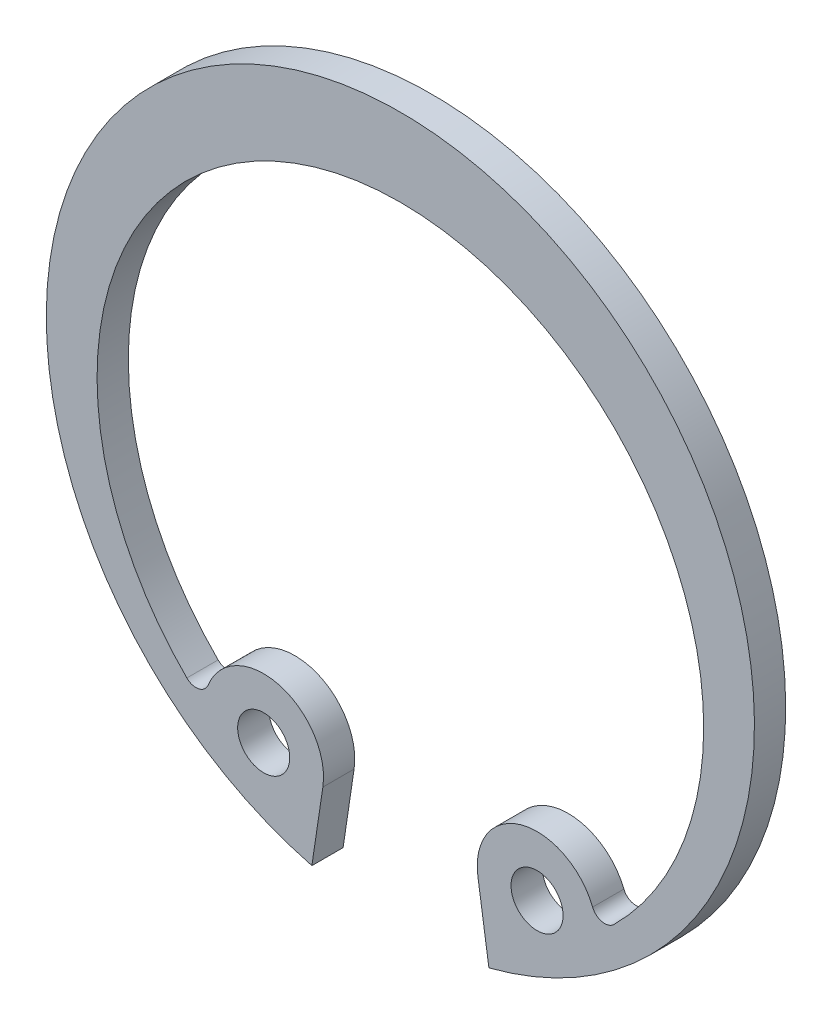
ISO-10303-21;
HEADER;
FILE_DESCRIPTION(('STEP AP214'),'2;1');
FILE_NAME('part.step','',(''),(''),'','','');
FILE_SCHEMA(('AUTOMOTIVE_DESIGN { 1 0 10303 214 1 1 1 1 }'));
ENDSEC;
DATA;
#1=APPLICATION_CONTEXT('core data for automotive mechanical design processes');
#2=APPLICATION_PROTOCOL_DEFINITION('international standard','automotive_design',2000,#1);
#3=PRODUCT_CONTEXT('',#1,'mechanical');
#4=PRODUCT('Part','Part','',(#3));
#5=PRODUCT_RELATED_PRODUCT_CATEGORY('part','',(#4));
#6=PRODUCT_DEFINITION_FORMATION('','',#4);
#7=PRODUCT_DEFINITION_CONTEXT('part definition',#1,'design');
#8=PRODUCT_DEFINITION('design','',#6,#7);
#9=PRODUCT_DEFINITION_SHAPE('','',#8);
#10=(LENGTH_UNIT() NAMED_UNIT(*) SI_UNIT(.MILLI.,.METRE.));
#11=(NAMED_UNIT(*) PLANE_ANGLE_UNIT() SI_UNIT($,.RADIAN.));
#12=(NAMED_UNIT(*) SI_UNIT($,.STERADIAN.) SOLID_ANGLE_UNIT());
#13=UNCERTAINTY_MEASURE_WITH_UNIT(LENGTH_MEASURE(1.E-05),#10,'distance_accuracy_value','');
#14=(GEOMETRIC_REPRESENTATION_CONTEXT(3) GLOBAL_UNCERTAINTY_ASSIGNED_CONTEXT((#13)) GLOBAL_UNIT_ASSIGNED_CONTEXT((#10,
#11,#12)) REPRESENTATION_CONTEXT('',''));
#15=CARTESIAN_POINT('',(0.,0.,0.));
#16=DIRECTION('',(0.,0.,1.));
#17=DIRECTION('',(1.,0.,0.));
#18=AXIS2_PLACEMENT_3D('',#15,#16,#17);
#19=CARTESIAN_POINT('',(-5.25,-10.0034878186672,1.2));
#20=DIRECTION('',(0.,0.,1.));
#21=DIRECTION('',(1.,0.,0.));
#22=AXIS2_PLACEMENT_3D('',#19,#20,#21);
#23=PLANE('',#22);
#24=CARTESIAN_POINT('',(-5.25,-10.0034878186672,1.2));
#25=DIRECTION('',(0.,0.,1.));
#26=DIRECTION('',(1.,0.,0.));
#27=AXIS2_PLACEMENT_3D('',#24,#25,#26);
#28=CIRCLE('',#27,1.);
#29=CARTESIAN_POINT('',(-4.25,-10.0034878186672,1.2));
#30=VERTEX_POINT('',#29);
#31=EDGE_CURVE('E134',#30,#30,#28,.T.);
#32=ORIENTED_EDGE('',*,*,#31,.F.);
#33=EDGE_LOOP('',(#32));
#34=FACE_BOUND('',#33,.T.);
#35=CARTESIAN_POINT('',(-5.25,-10.0034878186672,1.2));
#36=DIRECTION('',(0.,0.,1.));
#37=DIRECTION('',(1.,0.,0.));
#38=AXIS2_PLACEMENT_3D('',#35,#36,#37);
#39=CIRCLE('',#38,2.29744522174032);
#40=CARTESIAN_POINT('',(-2.97779023049379,-10.3430718439952,1.2));
#41=VERTEX_POINT('',#40);
#42=CARTESIAN_POINT('',(-7.38462817739894,-9.15400733557656,1.2));
#43=VERTEX_POINT('',#42);
#44=EDGE_CURVE('E145',#41,#43,#39,.T.);
#45=ORIENTED_EDGE('',*,*,#44,.T.);
#46=CARTESIAN_POINT('',(-7.84919380821341,-8.96913231112502,1.2));
#47=DIRECTION('',(0.,0.,-1.));
#48=DIRECTION('',(1.,0.,0.));
#49=AXIS2_PLACEMENT_3D('',#46,#47,#48);
#50=CIRCLE('',#49,0.499999999999999);
#51=CARTESIAN_POINT('',(-8.20117559333509,-9.32425035198264,1.2));
#52=VERTEX_POINT('',#51);
#53=EDGE_CURVE('E93',#43,#52,#50,.T.);
#54=ORIENTED_EDGE('',*,*,#53,.T.);
#55=CARTESIAN_POINT('',(0.,-1.05,1.2));
#56=DIRECTION('',(0.,0.,-1.));
#57=DIRECTION('',(1.,0.,0.));
#58=AXIS2_PLACEMENT_3D('',#55,#56,#57);
#59=CIRCLE('',#58,11.65);
#60=CARTESIAN_POINT('',(8.20117559333508,-9.32425035198264,1.2));
#61=VERTEX_POINT('',#60);
#62=EDGE_CURVE('E160',#52,#61,#59,.T.);
#63=ORIENTED_EDGE('',*,*,#62,.T.);
#64=CARTESIAN_POINT('',(7.84919380821341,-8.96913231112502,1.2));
#65=DIRECTION('',(0.,0.,-1.));
#66=DIRECTION('',(-1.,0.,0.));
#67=AXIS2_PLACEMENT_3D('',#64,#65,#66);
#68=CIRCLE('',#67,0.499999999999999);
#69=CARTESIAN_POINT('',(7.38462817739894,-9.15400733557656,1.2));
#70=VERTEX_POINT('',#69);
#71=EDGE_CURVE('E173',#61,#70,#68,.T.);
#72=ORIENTED_EDGE('',*,*,#71,.T.);
#73=CARTESIAN_POINT('',(5.25,-10.0034878186672,1.2));
#74=DIRECTION('',(0.,0.,1.));
#75=DIRECTION('',(1.,0.,0.));
#76=AXIS2_PLACEMENT_3D('',#73,#74,#75);
#77=CIRCLE('',#76,2.29744522174032);
#78=CARTESIAN_POINT('',(2.97779023049379,-10.3430718439952,1.2));
#79=VERTEX_POINT('',#78);
#80=EDGE_CURVE('E112',#70,#79,#77,.T.);
#81=ORIENTED_EDGE('',*,*,#80,.T.);
#82=DIRECTION('',(0.147809411129611,-0.989015863361917,0.));
#83=VECTOR('',#82,1.);
#84=CARTESIAN_POINT('',(2.97779023049379,-10.3430718439952,1.2));
#85=LINE('',#84,#83);
#86=CARTESIAN_POINT('',(3.4,-13.1681433771052,1.2));
#87=VERTEX_POINT('',#86);
#88=EDGE_CURVE('E106',#79,#87,#85,.T.);
#89=ORIENTED_EDGE('',*,*,#88,.T.);
#90=CARTESIAN_POINT('',(0.,0.,1.2));
#91=DIRECTION('',(0.,0.,1.));
#92=DIRECTION('',(1.,0.,0.));
#93=AXIS2_PLACEMENT_3D('',#90,#91,#92);
#94=CIRCLE('',#93,13.6);
#95=CARTESIAN_POINT('',(-3.4,-13.1681433771052,1.2));
#96=VERTEX_POINT('',#95);
#97=EDGE_CURVE('E110',#87,#96,#94,.T.);
#98=ORIENTED_EDGE('',*,*,#97,.T.);
#99=DIRECTION('',(0.147809411129611,0.989015863361917,0.));
#100=VECTOR('',#99,1.);
#101=CARTESIAN_POINT('',(-2.97779023049379,-10.3430718439952,1.2));
#102=LINE('',#101,#100);
#103=EDGE_CURVE('E50',#96,#41,#102,.T.);
#104=ORIENTED_EDGE('',*,*,#103,.T.);
#105=EDGE_LOOP('',(#45,#54,#63,#72,#81,#89,#98,#104));
#106=FACE_BOUND('',#105,.T.);
#107=CARTESIAN_POINT('',(5.25,-10.0034878186672,1.2));
#108=DIRECTION('',(0.,0.,1.));
#109=DIRECTION('',(1.,0.,0.));
#110=AXIS2_PLACEMENT_3D('',#107,#108,#109);
#111=CIRCLE('',#110,1.);
#112=CARTESIAN_POINT('',(6.25,-10.0034878186672,1.2));
#113=VERTEX_POINT('',#112);
#114=EDGE_CURVE('E182',#113,#113,#111,.T.);
#115=ORIENTED_EDGE('',*,*,#114,.F.);
#116=EDGE_LOOP('',(#115));
#117=FACE_BOUND('',#116,.T.);
#118=ADVANCED_FACE('F33',(#34,#106,#117),#23,.T.);
#119=CARTESIAN_POINT('',(-5.25,-10.0034878186672,0.));
#120=DIRECTION('',(0.,0.,1.));
#121=DIRECTION('',(1.,0.,0.));
#122=AXIS2_PLACEMENT_3D('',#119,#120,#121);
#123=PLANE('',#122);
#124=CARTESIAN_POINT('',(-5.25,-10.0034878186672,0.));
#125=DIRECTION('',(0.,0.,1.));
#126=DIRECTION('',(1.,0.,0.));
#127=AXIS2_PLACEMENT_3D('',#124,#125,#126);
#128=CIRCLE('',#127,2.29744522174032);
#129=CARTESIAN_POINT('',(-2.97779023049379,-10.3430718439952,0.));
#130=VERTEX_POINT('',#129);
#131=CARTESIAN_POINT('',(-7.38462817739894,-9.15400733557656,0.));
#132=VERTEX_POINT('',#131);
#133=EDGE_CURVE('E130',#130,#132,#128,.T.);
#134=ORIENTED_EDGE('',*,*,#133,.F.);
#135=DIRECTION('',(0.147809411129611,0.989015863361917,0.));
#136=VECTOR('',#135,1.);
#137=CARTESIAN_POINT('',(-2.97779023049379,-10.3430718439952,0.));
#138=LINE('',#137,#136);
#139=CARTESIAN_POINT('',(-3.4,-13.1681433771052,0.));
#140=VERTEX_POINT('',#139);
#141=EDGE_CURVE('E85',#140,#130,#138,.T.);
#142=ORIENTED_EDGE('',*,*,#141,.F.);
#143=CARTESIAN_POINT('',(0.,0.,0.));
#144=DIRECTION('',(0.,0.,1.));
#145=DIRECTION('',(1.,0.,0.));
#146=AXIS2_PLACEMENT_3D('',#143,#144,#145);
#147=CIRCLE('',#146,13.6);
#148=CARTESIAN_POINT('',(3.4,-13.1681433771052,0.));
#149=VERTEX_POINT('',#148);
#150=EDGE_CURVE('E79',#149,#140,#147,.T.);
#151=ORIENTED_EDGE('',*,*,#150,.F.);
#152=DIRECTION('',(0.147809411129611,-0.989015863361917,0.));
#153=VECTOR('',#152,1.);
#154=CARTESIAN_POINT('',(2.97779023049379,-10.3430718439952,0.));
#155=LINE('',#154,#153);
#156=CARTESIAN_POINT('',(2.97779023049379,-10.3430718439952,0.));
#157=VERTEX_POINT('',#156);
#158=EDGE_CURVE('E120',#157,#149,#155,.T.);
#159=ORIENTED_EDGE('',*,*,#158,.F.);
#160=CARTESIAN_POINT('',(5.25,-10.0034878186672,0.));
#161=DIRECTION('',(0.,0.,1.));
#162=DIRECTION('',(1.,0.,0.));
#163=AXIS2_PLACEMENT_3D('',#160,#161,#162);
#164=CIRCLE('',#163,2.29744522174032);
#165=CARTESIAN_POINT('',(7.38462817739894,-9.15400733557656,0.));
#166=VERTEX_POINT('',#165);
#167=EDGE_CURVE('E140',#166,#157,#164,.T.);
#168=ORIENTED_EDGE('',*,*,#167,.F.);
#169=CARTESIAN_POINT('',(7.84919380821341,-8.96913231112502,0.));
#170=DIRECTION('',(0.,0.,-1.));
#171=DIRECTION('',(-1.,0.,0.));
#172=AXIS2_PLACEMENT_3D('',#169,#170,#171);
#173=CIRCLE('',#172,0.499999999999999);
#174=CARTESIAN_POINT('',(8.20117559333508,-9.32425035198264,0.));
#175=VERTEX_POINT('',#174);
#176=EDGE_CURVE('E138',#175,#166,#173,.T.);
#177=ORIENTED_EDGE('',*,*,#176,.F.);
#178=CARTESIAN_POINT('',(0.,-1.05,0.));
#179=DIRECTION('',(0.,0.,-1.));
#180=DIRECTION('',(1.,0.,0.));
#181=AXIS2_PLACEMENT_3D('',#178,#179,#180);
#182=CIRCLE('',#181,11.65);
#183=CARTESIAN_POINT('',(-8.20117559333509,-9.32425035198264,0.));
#184=VERTEX_POINT('',#183);
#185=EDGE_CURVE('E136',#184,#175,#182,.T.);
#186=ORIENTED_EDGE('',*,*,#185,.F.);
#187=CARTESIAN_POINT('',(-7.84919380821341,-8.96913231112502,0.));
#188=DIRECTION('',(0.,0.,-1.));
#189=DIRECTION('',(1.,0.,0.));
#190=AXIS2_PLACEMENT_3D('',#187,#188,#189);
#191=CIRCLE('',#190,0.499999999999999);
#192=EDGE_CURVE('E133',#132,#184,#191,.T.);
#193=ORIENTED_EDGE('',*,*,#192,.F.);
#194=EDGE_LOOP('',(#134,#142,#151,#159,#168,#177,#186,#193));
#195=FACE_BOUND('',#194,.T.);
#196=CARTESIAN_POINT('',(-5.25,-10.0034878186672,0.));
#197=DIRECTION('',(0.,0.,1.));
#198=DIRECTION('',(1.,0.,0.));
#199=AXIS2_PLACEMENT_3D('',#196,#197,#198);
#200=CIRCLE('',#199,1.);
#201=CARTESIAN_POINT('',(-4.25,-10.0034878186672,0.));
#202=VERTEX_POINT('',#201);
#203=EDGE_CURVE('E179',#202,#202,#200,.T.);
#204=ORIENTED_EDGE('',*,*,#203,.T.);
#205=EDGE_LOOP('',(#204));
#206=FACE_BOUND('',#205,.T.);
#207=CARTESIAN_POINT('',(5.25,-10.0034878186672,0.));
#208=DIRECTION('',(0.,0.,1.));
#209=DIRECTION('',(1.,0.,0.));
#210=AXIS2_PLACEMENT_3D('',#207,#208,#209);
#211=CIRCLE('',#210,1.);
#212=CARTESIAN_POINT('',(6.25,-10.0034878186672,0.));
#213=VERTEX_POINT('',#212);
#214=EDGE_CURVE('E185',#213,#213,#211,.T.);
#215=ORIENTED_EDGE('',*,*,#214,.T.);
#216=EDGE_LOOP('',(#215));
#217=FACE_BOUND('',#216,.T.);
#218=ADVANCED_FACE('F164',(#195,#206,#217),#123,.F.);
#219=CARTESIAN_POINT('',(-5.25,-10.0034878186672,1.2));
#220=DIRECTION('',(0.,0.,-1.));
#221=DIRECTION('',(-1.,0.,0.));
#222=AXIS2_PLACEMENT_3D('',#219,#220,#221);
#223=CYLINDRICAL_SURFACE('',#222,2.29744522174032);
#224=ORIENTED_EDGE('',*,*,#133,.T.);
#225=DIRECTION('',(0.,0.,-1.));
#226=VECTOR('',#225,1.);
#227=CARTESIAN_POINT('',(-7.38462817739894,-9.15400733557656,1.2));
#228=LINE('',#227,#226);
#229=EDGE_CURVE('E11',#43,#132,#228,.T.);
#230=ORIENTED_EDGE('',*,*,#229,.F.);
#231=ORIENTED_EDGE('',*,*,#44,.F.);
#232=DIRECTION('',(0.,0.,-1.));
#233=VECTOR('',#232,1.);
#234=CARTESIAN_POINT('',(-2.97779023049379,-10.3430718439952,1.2));
#235=LINE('',#234,#233);
#236=EDGE_CURVE('E126',#41,#130,#235,.T.);
#237=ORIENTED_EDGE('',*,*,#236,.T.);
#238=EDGE_LOOP('',(#224,#230,#231,#237));
#239=FACE_BOUND('',#238,.T.);
#240=ADVANCED_FACE('F35',(#239),#223,.T.);
#241=CARTESIAN_POINT('',(-7.84919380821341,-8.96913231112502,1.2));
#242=DIRECTION('',(0.,0.,-1.));
#243=DIRECTION('',(-1.,0.,0.));
#244=AXIS2_PLACEMENT_3D('',#241,#242,#243);
#245=CYLINDRICAL_SURFACE('',#244,0.499999999999999);
#246=ORIENTED_EDGE('',*,*,#192,.T.);
#247=DIRECTION('',(0.,0.,-1.));
#248=VECTOR('',#247,1.);
#249=CARTESIAN_POINT('',(-8.20117559333509,-9.32425035198264,1.2));
#250=LINE('',#249,#248);
#251=EDGE_CURVE('E42',#52,#184,#250,.T.);
#252=ORIENTED_EDGE('',*,*,#251,.F.);
#253=ORIENTED_EDGE('',*,*,#53,.F.);
#254=ORIENTED_EDGE('',*,*,#229,.T.);
#255=EDGE_LOOP('',(#246,#252,#253,#254));
#256=FACE_BOUND('',#255,.T.);
#257=ADVANCED_FACE('F217',(#256),#245,.F.);
#258=CARTESIAN_POINT('',(0.,-1.05,1.2));
#259=DIRECTION('',(0.,0.,-1.));
#260=DIRECTION('',(-1.,0.,0.));
#261=AXIS2_PLACEMENT_3D('',#258,#259,#260);
#262=CYLINDRICAL_SURFACE('',#261,11.65);
#263=ORIENTED_EDGE('',*,*,#185,.T.);
#264=DIRECTION('',(0.,0.,-1.));
#265=VECTOR('',#264,1.);
#266=CARTESIAN_POINT('',(8.20117559333508,-9.32425035198264,1.2));
#267=LINE('',#266,#265);
#268=EDGE_CURVE('E152',#61,#175,#267,.T.);
#269=ORIENTED_EDGE('',*,*,#268,.F.);
#270=ORIENTED_EDGE('',*,*,#62,.F.);
#271=ORIENTED_EDGE('',*,*,#251,.T.);
#272=EDGE_LOOP('',(#263,#269,#270,#271));
#273=FACE_BOUND('',#272,.T.);
#274=ADVANCED_FACE('F158',(#273),#262,.F.);
#275=CARTESIAN_POINT('',(7.84919380821341,-8.96913231112502,1.2));
#276=DIRECTION('',(0.,0.,-1.));
#277=DIRECTION('',(-1.,0.,0.));
#278=AXIS2_PLACEMENT_3D('',#275,#276,#277);
#279=CYLINDRICAL_SURFACE('',#278,0.499999999999999);
#280=ORIENTED_EDGE('',*,*,#176,.T.);
#281=DIRECTION('',(0.,0.,-1.));
#282=VECTOR('',#281,1.);
#283=CARTESIAN_POINT('',(7.38462817739894,-9.15400733557656,1.2));
#284=LINE('',#283,#282);
#285=EDGE_CURVE('E149',#70,#166,#284,.T.);
#286=ORIENTED_EDGE('',*,*,#285,.F.);
#287=ORIENTED_EDGE('',*,*,#71,.F.);
#288=ORIENTED_EDGE('',*,*,#268,.T.);
#289=EDGE_LOOP('',(#280,#286,#287,#288));
#290=FACE_BOUND('',#289,.T.);
#291=ADVANCED_FACE('F169',(#290),#279,.F.);
#292=CARTESIAN_POINT('',(5.25,-10.0034878186672,1.2));
#293=DIRECTION('',(0.,0.,-1.));
#294=DIRECTION('',(-1.,0.,0.));
#295=AXIS2_PLACEMENT_3D('',#292,#293,#294);
#296=CYLINDRICAL_SURFACE('',#295,2.29744522174032);
#297=ORIENTED_EDGE('',*,*,#167,.T.);
#298=DIRECTION('',(0.,0.,-1.));
#299=VECTOR('',#298,1.);
#300=CARTESIAN_POINT('',(2.97779023049379,-10.3430718439952,1.2));
#301=LINE('',#300,#299);
#302=EDGE_CURVE('E121',#79,#157,#301,.T.);
#303=ORIENTED_EDGE('',*,*,#302,.F.);
#304=ORIENTED_EDGE('',*,*,#80,.F.);
#305=ORIENTED_EDGE('',*,*,#285,.T.);
#306=EDGE_LOOP('',(#297,#303,#304,#305));
#307=FACE_BOUND('',#306,.T.);
#308=ADVANCED_FACE('F172',(#307),#296,.T.);
#309=CARTESIAN_POINT('',(2.97779023049379,-10.3430718439952,1.2));
#310=DIRECTION('',(0.989015863361917,0.147809411129611,0.));
#311=DIRECTION('',(-0.147809411129611,0.989015863361917,0.));
#312=AXIS2_PLACEMENT_3D('',#309,#310,#311);
#313=PLANE('',#312);
#314=ORIENTED_EDGE('',*,*,#158,.T.);
#315=DIRECTION('',(0.,0.,-1.));
#316=VECTOR('',#315,1.);
#317=CARTESIAN_POINT('',(3.4,-13.1681433771052,1.2));
#318=LINE('',#317,#316);
#319=EDGE_CURVE('E117',#87,#149,#318,.T.);
#320=ORIENTED_EDGE('',*,*,#319,.F.);
#321=ORIENTED_EDGE('',*,*,#88,.F.);
#322=ORIENTED_EDGE('',*,*,#302,.T.);
#323=EDGE_LOOP('',(#314,#320,#321,#322));
#324=FACE_BOUND('',#323,.T.);
#325=ADVANCED_FACE('F118',(#324),#313,.F.);
#326=CARTESIAN_POINT('',(0.,0.,1.2));
#327=DIRECTION('',(0.,0.,-1.));
#328=DIRECTION('',(-1.,0.,0.));
#329=AXIS2_PLACEMENT_3D('',#326,#327,#328);
#330=CYLINDRICAL_SURFACE('',#329,13.6);
#331=ORIENTED_EDGE('',*,*,#150,.T.);
#332=DIRECTION('',(0.,0.,-1.));
#333=VECTOR('',#332,1.);
#334=CARTESIAN_POINT('',(-3.4,-13.1681433771052,1.2));
#335=LINE('',#334,#333);
#336=EDGE_CURVE('E122',#96,#140,#335,.T.);
#337=ORIENTED_EDGE('',*,*,#336,.F.);
#338=ORIENTED_EDGE('',*,*,#97,.F.);
#339=ORIENTED_EDGE('',*,*,#319,.T.);
#340=EDGE_LOOP('',(#331,#337,#338,#339));
#341=FACE_BOUND('',#340,.T.);
#342=ADVANCED_FACE('F124',(#341),#330,.T.);
#343=CARTESIAN_POINT('',(-2.97779023049379,-10.3430718439952,1.2));
#344=DIRECTION('',(-0.989015863361917,0.147809411129611,0.));
#345=DIRECTION('',(-0.147809411129611,-0.989015863361917,0.));
#346=AXIS2_PLACEMENT_3D('',#343,#344,#345);
#347=PLANE('',#346);
#348=ORIENTED_EDGE('',*,*,#141,.T.);
#349=ORIENTED_EDGE('',*,*,#236,.F.);
#350=ORIENTED_EDGE('',*,*,#103,.F.);
#351=ORIENTED_EDGE('',*,*,#336,.T.);
#352=EDGE_LOOP('',(#348,#349,#350,#351));
#353=FACE_BOUND('',#352,.T.);
#354=ADVANCED_FACE('F205',(#353),#347,.F.);
#355=CARTESIAN_POINT('',(-5.25,-10.0034878186672,1.2));
#356=DIRECTION('',(0.,0.,-1.));
#357=DIRECTION('',(-1.,0.,0.));
#358=AXIS2_PLACEMENT_3D('',#355,#356,#357);
#359=CYLINDRICAL_SURFACE('',#358,1.);
#360=ORIENTED_EDGE('',*,*,#31,.T.);
#361=EDGE_LOOP('',(#360));
#362=FACE_BOUND('',#361,.T.);
#363=ORIENTED_EDGE('',*,*,#203,.F.);
#364=EDGE_LOOP('',(#363));
#365=FACE_BOUND('',#364,.T.);
#366=ADVANCED_FACE('F202',(#362,#365),#359,.F.);
#367=CARTESIAN_POINT('',(5.25,-10.0034878186672,1.2));
#368=DIRECTION('',(0.,0.,-1.));
#369=DIRECTION('',(-1.,0.,0.));
#370=AXIS2_PLACEMENT_3D('',#367,#368,#369);
#371=CYLINDRICAL_SURFACE('',#370,1.);
#372=ORIENTED_EDGE('',*,*,#114,.T.);
#373=EDGE_LOOP('',(#372));
#374=FACE_BOUND('',#373,.T.);
#375=ORIENTED_EDGE('',*,*,#214,.F.);
#376=EDGE_LOOP('',(#375));
#377=FACE_BOUND('',#376,.T.);
#378=ADVANCED_FACE('F191',(#374,#377),#371,.F.);
#379=CLOSED_SHELL('',(#118,#218,#240,#257,#274,#291,#308,#325,#342,#354,#366,#378));
#380=MANIFOLD_SOLID_BREP('B2',#379);
#381=ADVANCED_BREP_SHAPE_REPRESENTATION('',(#18,#380),#14);
#382=SHAPE_DEFINITION_REPRESENTATION(#9,#381);
ENDSEC;
END-ISO-10303-21;
